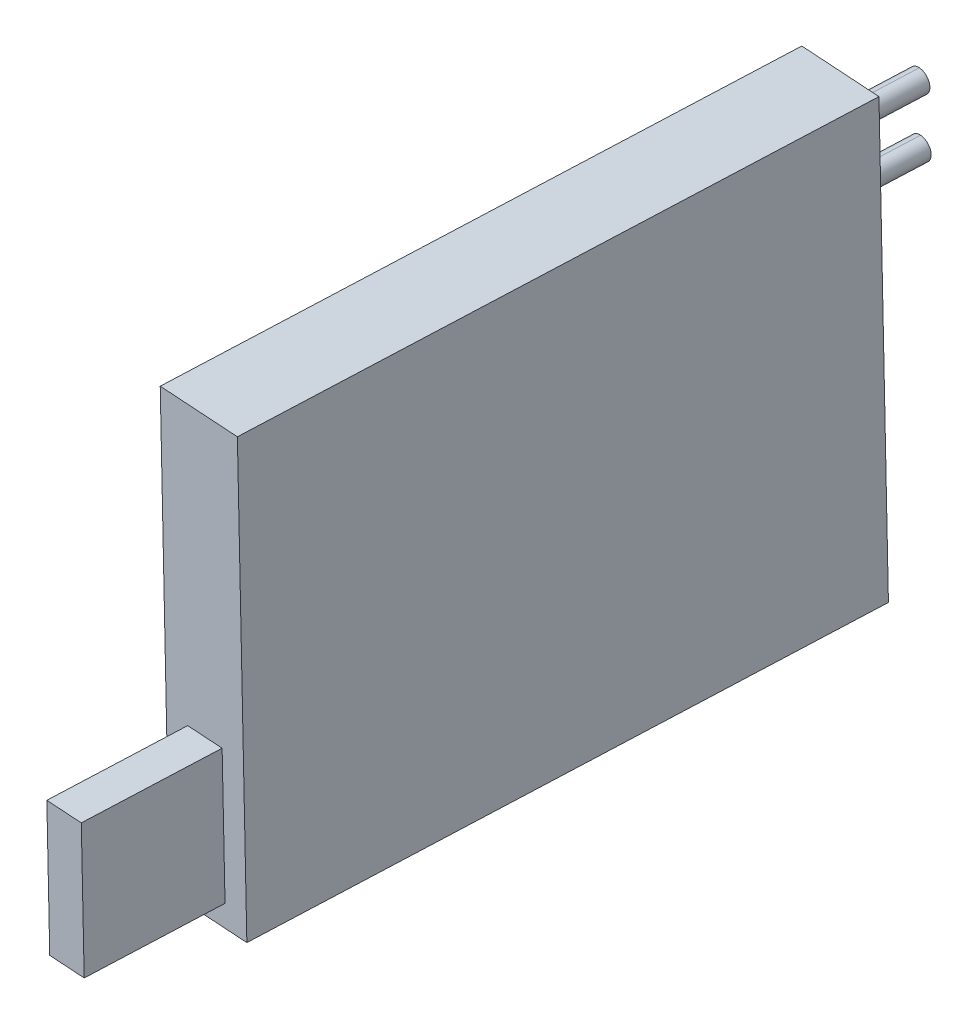
ISO-10303-21;
HEADER;
FILE_DESCRIPTION(('STEP AP214'),'2;1');
FILE_NAME('part.step','',(''),(''),'','','');
FILE_SCHEMA(('AUTOMOTIVE_DESIGN { 1 0 10303 214 1 1 1 1 }'));
ENDSEC;
DATA;
#1=APPLICATION_CONTEXT('core data for automotive mechanical design processes');
#2=APPLICATION_PROTOCOL_DEFINITION('international standard','automotive_design',2000,#1);
#3=PRODUCT_CONTEXT('',#1,'mechanical');
#4=PRODUCT('Part','Part','',(#3));
#5=PRODUCT_RELATED_PRODUCT_CATEGORY('part','',(#4));
#6=PRODUCT_DEFINITION_FORMATION('','',#4);
#7=PRODUCT_DEFINITION_CONTEXT('part definition',#1,'design');
#8=PRODUCT_DEFINITION('design','',#6,#7);
#9=PRODUCT_DEFINITION_SHAPE('','',#8);
#10=(LENGTH_UNIT() NAMED_UNIT(*) SI_UNIT(.MILLI.,.METRE.));
#11=(NAMED_UNIT(*) PLANE_ANGLE_UNIT() SI_UNIT($,.RADIAN.));
#12=(NAMED_UNIT(*) SI_UNIT($,.STERADIAN.) SOLID_ANGLE_UNIT());
#13=UNCERTAINTY_MEASURE_WITH_UNIT(LENGTH_MEASURE(1.E-05),#10,'distance_accuracy_value','');
#14=(GEOMETRIC_REPRESENTATION_CONTEXT(3) GLOBAL_UNCERTAINTY_ASSIGNED_CONTEXT((#13)) GLOBAL_UNIT_ASSIGNED_CONTEXT((#10,
#11,#12)) REPRESENTATION_CONTEXT('',''));
#15=CARTESIAN_POINT('',(0.,0.,0.));
#16=DIRECTION('',(0.,0.,1.));
#17=DIRECTION('',(1.,0.,0.));
#18=AXIS2_PLACEMENT_3D('',#15,#16,#17);
#19=CARTESIAN_POINT('',(-36.648079347406,344.820593225268,51.9658327744812));
#20=DIRECTION('',(0.997981596765968,-1.57E-13,0.063503799228458));
#21=DIRECTION('',(0.0634908764880217,0.0201729939782295,-0.997778511953799));
#22=AXIS2_PLACEMENT_3D('',#19,#20,#21);
#23=PLANE('',#22);
#24=DIRECTION('',(-0.0634908764880217,-0.0201729939782295,0.997778511953799));
#25=VECTOR('',#24,1.);
#26=CARTESIAN_POINT('',(-35.3657323057906,360.231087168598,31.8133574305576));
#27=LINE('',#26,#25);
#28=CARTESIAN_POINT('',(-35.3657323057906,360.231087168598,31.8133574305576));
#29=VERTEX_POINT('',#28);
#30=CARTESIAN_POINT('',(-37.9688582417995,359.403994415491,72.7222764206633));
#31=VERTEX_POINT('',#30);
#32=EDGE_CURVE('E183',#29,#31,#27,.T.);
#33=ORIENTED_EDGE('',*,*,#32,.F.);
#34=DIRECTION('',(-0.00128106175927373,0.999796504451758,0.0201322767419537));
#35=VECTOR('',#34,1.);
#36=CARTESIAN_POINT('',(-35.3273004530124,330.237192035045,31.209389128299));
#37=LINE('',#36,#35);
#38=CARTESIAN_POINT('',(-35.3273004530124,330.237192035045,31.209389128299));
#39=VERTEX_POINT('',#38);
#40=EDGE_CURVE('E41',#39,#29,#37,.T.);
#41=ORIENTED_EDGE('',*,*,#40,.F.);
#42=DIRECTION('',(0.0634908764880217,0.0201729939782295,-0.997778511953799));
#43=VECTOR('',#42,1.);
#44=CARTESIAN_POINT('',(-37.9304263890213,329.410099281938,72.1183081184047));
#45=LINE('',#44,#43);
#46=CARTESIAN_POINT('',(-37.9304263890213,329.410099281938,72.1183081184047));
#47=VERTEX_POINT('',#46);
#48=EDGE_CURVE('E199',#47,#39,#45,.T.);
#49=ORIENTED_EDGE('',*,*,#48,.F.);
#50=DIRECTION('',(0.00128106175927373,-0.999796504451758,-0.0201322767419537));
#51=VECTOR('',#50,1.);
#52=CARTESIAN_POINT('',(-37.9688582417995,359.403994415491,72.7222764206633));
#53=LINE('',#52,#51);
#54=EDGE_CURVE('E27',#31,#47,#53,.T.);
#55=ORIENTED_EDGE('',*,*,#54,.F.);
#56=EDGE_LOOP('',(#33,#41,#49,#55));
#57=FACE_BOUND('',#56,.T.);
#58=CARTESIAN_POINT('',(-35.5863882060016,334.155686076939,35.281032283082));
#59=DIRECTION('',(-0.997981596765968,1.57E-13,-0.063503799228458));
#60=DIRECTION('',(0.0634908764880217,0.0201729939782295,-0.997778511953799));
#61=AXIS2_PLACEMENT_3D('',#58,#59,#60);
#62=CIRCLE('',#61,0.6);
#63=CARTESIAN_POINT('',(-35.5482936801088,334.167789873326,34.6823651759097));
#64=VERTEX_POINT('',#63);
#65=CARTESIAN_POINT('',(-35.6244827318944,334.143582280552,35.8796993902543));
#66=VERTEX_POINT('',#65);
#67=EDGE_CURVE('E232',#64,#66,#62,.T.);
#68=ORIENTED_EDGE('',*,*,#67,.F.);
#69=CARTESIAN_POINT('',(-35.5863882060016,334.155686076939,35.281032283082));
#70=DIRECTION('',(-0.997981596765968,1.57E-13,-0.063503799228458));
#71=DIRECTION('',(-0.0634908764880217,-0.0201729939782295,0.997778511953799));
#72=AXIS2_PLACEMENT_3D('',#69,#70,#71);
#73=CIRCLE('',#72,0.6);
#74=EDGE_CURVE('E161',#66,#64,#73,.T.);
#75=ORIENTED_EDGE('',*,*,#74,.F.);
#76=EDGE_LOOP('',(#68,#75));
#77=FACE_BOUND('',#76,.T.);
#78=CARTESIAN_POINT('',(-36.0625697796618,334.004388622103,42.7643711227355));
#79=DIRECTION('',(-0.997981596765968,1.57E-13,-0.063503799228458));
#80=DIRECTION('',(0.0634908764880217,0.0201729939782295,-0.997778511953799));
#81=AXIS2_PLACEMENT_3D('',#78,#79,#80);
#82=CIRCLE('',#81,0.6);
#83=CARTESIAN_POINT('',(-36.024475253769,334.01649241849,42.1657040155632));
#84=VERTEX_POINT('',#83);
#85=CARTESIAN_POINT('',(-36.1006643055546,333.992284825716,43.3630382299078));
#86=VERTEX_POINT('',#85);
#87=EDGE_CURVE('E113',#84,#86,#82,.T.);
#88=ORIENTED_EDGE('',*,*,#87,.F.);
#89=CARTESIAN_POINT('',(-36.0625697796618,334.004388622103,42.7643711227355));
#90=DIRECTION('',(-0.997981596765968,1.57E-13,-0.063503799228458));
#91=DIRECTION('',(-0.0634908764880217,-0.0201729939782295,0.997778511953799));
#92=AXIS2_PLACEMENT_3D('',#89,#90,#91);
#93=CIRCLE('',#92,0.6);
#94=EDGE_CURVE('E115',#86,#84,#93,.T.);
#95=ORIENTED_EDGE('',*,*,#94,.F.);
#96=EDGE_LOOP('',(#88,#95));
#97=FACE_BOUND('',#96,.T.);
#98=ADVANCED_FACE('F16',(#57,#77,#97),#23,.F.);
#99=CARTESIAN_POINT('',(-37.9688582417995,359.403994415491,72.7222764206633));
#100=DIRECTION('',(-0.0634908764880217,-0.0201729939782295,0.997778511953799));
#101=DIRECTION('',(0.997981596765968,-1.57E-13,0.063503799228458));
#102=AXIS2_PLACEMENT_3D('',#99,#100,#101);
#103=PLANE('',#102);
#104=DIRECTION('',(0.997981596765968,-1.57E-13,0.063503799228458));
#105=VECTOR('',#104,1.);
#106=CARTESIAN_POINT('',(-37.9304263890213,329.410099281938,72.1183081184047));
#107=LINE('',#106,#105);
#108=CARTESIAN_POINT('',(-32.3417294471319,329.410099281937,72.4739293940841));
#109=VERTEX_POINT('',#108);
#110=EDGE_CURVE('E11',#47,#109,#107,.T.);
#111=ORIENTED_EDGE('',*,*,#110,.T.);
#112=DIRECTION('',(0.00128106175927373,-0.999796504451758,-0.0201322767419537));
#113=VECTOR('',#112,1.);
#114=CARTESIAN_POINT('',(-32.3801612999101,359.40399441549,73.0778976963427));
#115=LINE('',#114,#113);
#116=CARTESIAN_POINT('',(-32.3801612999101,359.40399441549,73.0778976963427));
#117=VERTEX_POINT('',#116);
#118=EDGE_CURVE('E206',#117,#109,#115,.T.);
#119=ORIENTED_EDGE('',*,*,#118,.F.);
#120=DIRECTION('',(0.997981596765968,-1.57E-13,0.063503799228458));
#121=VECTOR('',#120,1.);
#122=CARTESIAN_POINT('',(-37.9688582417995,359.403994415491,72.7222764206633));
#123=LINE('',#122,#121);
#124=EDGE_CURVE('E179',#31,#117,#123,.T.);
#125=ORIENTED_EDGE('',*,*,#124,.F.);
#126=ORIENTED_EDGE('',*,*,#54,.T.);
#127=EDGE_LOOP('',(#111,#119,#125,#126));
#128=FACE_BOUND('',#127,.T.);
#129=DIRECTION('',(-0.997981596765968,1.57E-13,-0.063503799228458));
#130=VECTOR('',#129,1.);
#131=CARTESIAN_POINT('',(-33.9023082829434,340.107921879571,72.5909138664189));
#132=LINE('',#131,#130);
#133=CARTESIAN_POINT('',(-33.9023082829434,340.107921879571,72.5909138664189));
#134=VERTEX_POINT('',#133);
#135=CARTESIAN_POINT('',(-36.3972622748583,340.107921879571,72.4321543683477));
#136=VERTEX_POINT('',#135);
#137=EDGE_CURVE('E220',#134,#136,#132,.T.);
#138=ORIENTED_EDGE('',*,*,#137,.F.);
#139=DIRECTION('',(-0.00128106175927373,0.999796504451758,0.0201322767419537));
#140=VECTOR('',#139,1.);
#141=CARTESIAN_POINT('',(-33.8905225147581,330.909794038615,72.4056969203929));
#142=LINE('',#141,#140);
#143=CARTESIAN_POINT('',(-33.8905225147581,330.909794038615,72.4056969203929));
#144=VERTEX_POINT('',#143);
#145=EDGE_CURVE('E189',#144,#134,#142,.T.);
#146=ORIENTED_EDGE('',*,*,#145,.F.);
#147=DIRECTION('',(0.997981596765968,-1.57E-13,0.063503799228458));
#148=VECTOR('',#147,1.);
#149=CARTESIAN_POINT('',(-36.385476506673,330.909794038615,72.2469374223218));
#150=LINE('',#149,#148);
#151=CARTESIAN_POINT('',(-36.385476506673,330.909794038615,72.2469374223218));
#152=VERTEX_POINT('',#151);
#153=EDGE_CURVE('E237',#152,#144,#150,.T.);
#154=ORIENTED_EDGE('',*,*,#153,.F.);
#155=DIRECTION('',(0.00128106175927373,-0.999796504451758,-0.0201322767419537));
#156=VECTOR('',#155,1.);
#157=CARTESIAN_POINT('',(-36.3972622748583,340.107921879571,72.4321543683477));
#158=LINE('',#157,#156);
#159=EDGE_CURVE('E211',#136,#152,#158,.T.);
#160=ORIENTED_EDGE('',*,*,#159,.F.);
#161=EDGE_LOOP('',(#138,#146,#154,#160));
#162=FACE_BOUND('',#161,.T.);
#163=ADVANCED_FACE('F364',(#128,#162),#103,.T.);
#164=CARTESIAN_POINT('',(-35.3657323057906,360.231087168598,31.8133574305576));
#165=DIRECTION('',(-0.00128106175927373,0.999796504451758,0.0201322767419537));
#166=DIRECTION('',(0.0634908764880217,0.0201729939782295,-0.997778511953799));
#167=AXIS2_PLACEMENT_3D('',#164,#165,#166);
#168=PLANE('',#167);
#169=ORIENTED_EDGE('',*,*,#124,.T.);
#170=DIRECTION('',(-0.0634908764880217,-0.0201729939782295,0.997778511953799));
#171=VECTOR('',#170,1.);
#172=CARTESIAN_POINT('',(-29.7770353639012,360.231087168597,32.1689787062369));
#173=LINE('',#172,#171);
#174=CARTESIAN_POINT('',(-29.7770353639012,360.231087168597,32.1689787062369));
#175=VERTEX_POINT('',#174);
#176=EDGE_CURVE('E209',#175,#117,#173,.T.);
#177=ORIENTED_EDGE('',*,*,#176,.F.);
#178=DIRECTION('',(0.997981596765968,-1.57E-13,0.063503799228458));
#179=VECTOR('',#178,1.);
#180=CARTESIAN_POINT('',(-35.3657323057906,360.231087168598,31.8133574305576));
#181=LINE('',#180,#179);
#182=EDGE_CURVE('E202',#29,#175,#181,.T.);
#183=ORIENTED_EDGE('',*,*,#182,.F.);
#184=ORIENTED_EDGE('',*,*,#32,.T.);
#185=EDGE_LOOP('',(#169,#177,#183,#184));
#186=FACE_BOUND('',#185,.T.);
#187=ADVANCED_FACE('F370',(#186),#168,.T.);
#188=CARTESIAN_POINT('',(-35.3273004530124,330.237192035045,31.209389128299));
#189=DIRECTION('',(0.0634908764880217,0.0201729939782295,-0.997778511953799));
#190=DIRECTION('',(-0.00128106175927373,0.999796504451758,0.0201322767419537));
#191=AXIS2_PLACEMENT_3D('',#188,#189,#190);
#192=PLANE('',#191);
#193=ORIENTED_EDGE('',*,*,#182,.T.);
#194=DIRECTION('',(-0.00128106175927373,0.999796504451758,0.0201322767419537));
#195=VECTOR('',#194,1.);
#196=CARTESIAN_POINT('',(-29.738603511123,330.237192035044,31.5650104039783));
#197=LINE('',#196,#195);
#198=CARTESIAN_POINT('',(-29.738603511123,330.237192035044,31.5650104039783));
#199=VERTEX_POINT('',#198);
#200=EDGE_CURVE('E146',#199,#175,#197,.T.);
#201=ORIENTED_EDGE('',*,*,#200,.F.);
#202=DIRECTION('',(0.997981596765968,-1.57E-13,0.063503799228458));
#203=VECTOR('',#202,1.);
#204=CARTESIAN_POINT('',(-35.3273004530124,330.237192035045,31.209389128299));
#205=LINE('',#204,#203);
#206=EDGE_CURVE('E195',#39,#199,#205,.T.);
#207=ORIENTED_EDGE('',*,*,#206,.F.);
#208=ORIENTED_EDGE('',*,*,#40,.T.);
#209=EDGE_LOOP('',(#193,#201,#207,#208));
#210=FACE_BOUND('',#209,.T.);
#211=CARTESIAN_POINT('',(-32.5675406495681,357.231697655242,31.9307712381714));
#212=DIRECTION('',(0.0634908764880217,0.0201729939782295,-0.997778511953799));
#213=DIRECTION('',(-0.00128106175927373,0.999796504451758,0.0201322767419537));
#214=AXIS2_PLACEMENT_3D('',#211,#212,#213);
#215=CIRCLE('',#214,0.75);
#216=CARTESIAN_POINT('',(-32.5685014458876,357.981545033581,31.9458704457279));
#217=VERTEX_POINT('',#216);
#218=CARTESIAN_POINT('',(-32.5665798532486,356.481850276904,31.9156720306149));
#219=VERTEX_POINT('',#218);
#220=EDGE_CURVE('E150',#217,#219,#215,.T.);
#221=ORIENTED_EDGE('',*,*,#220,.F.);
#222=CARTESIAN_POINT('',(-32.5675406495681,357.231697655242,31.9307712381714));
#223=DIRECTION('',(0.0634908764880217,0.0201729939782295,-0.997778511953799));
#224=DIRECTION('',(0.00128106175927373,-0.999796504451758,-0.0201322767419537));
#225=AXIS2_PLACEMENT_3D('',#222,#223,#224);
#226=CIRCLE('',#225,0.75);
#227=EDGE_CURVE('E233',#219,#217,#226,.T.);
#228=ORIENTED_EDGE('',*,*,#227,.F.);
#229=EDGE_LOOP('',(#221,#228));
#230=FACE_BOUND('',#229,.T.);
#231=CARTESIAN_POINT('',(-32.562416402531,353.232511637435,31.8502421312036));
#232=DIRECTION('',(0.0634908764880217,0.0201729939782295,-0.997778511953799));
#233=DIRECTION('',(-0.00128106175927373,0.999796504451758,0.0201322767419537));
#234=AXIS2_PLACEMENT_3D('',#231,#232,#233);
#235=CIRCLE('',#234,0.75);
#236=CARTESIAN_POINT('',(-32.5633771988505,353.982359015774,31.8653413387601));
#237=VERTEX_POINT('',#236);
#238=CARTESIAN_POINT('',(-32.5614556062116,352.482664259096,31.8351429236471));
#239=VERTEX_POINT('',#238);
#240=EDGE_CURVE('E249',#237,#239,#235,.T.);
#241=ORIENTED_EDGE('',*,*,#240,.F.);
#242=CARTESIAN_POINT('',(-32.562416402531,353.232511637435,31.8502421312036));
#243=DIRECTION('',(0.0634908764880217,0.0201729939782295,-0.997778511953799));
#244=DIRECTION('',(0.00128106175927373,-0.999796504451758,-0.0201322767419537));
#245=AXIS2_PLACEMENT_3D('',#242,#243,#244);
#246=CIRCLE('',#245,0.75);
#247=EDGE_CURVE('E173',#239,#237,#246,.T.);
#248=ORIENTED_EDGE('',*,*,#247,.F.);
#249=EDGE_LOOP('',(#241,#248));
#250=FACE_BOUND('',#249,.T.);
#251=ADVANCED_FACE('F297',(#210,#230,#250),#192,.T.);
#252=CARTESIAN_POINT('',(-37.9304263890213,329.410099281938,72.1183081184047));
#253=DIRECTION('',(0.00128106175927373,-0.999796504451758,-0.0201322767419537));
#254=DIRECTION('',(-0.997981596765968,1.57E-13,-0.063503799228458));
#255=AXIS2_PLACEMENT_3D('',#252,#253,#254);
#256=PLANE('',#255);
#257=ORIENTED_EDGE('',*,*,#206,.T.);
#258=DIRECTION('',(0.0634908764880217,0.0201729939782295,-0.997778511953799));
#259=VECTOR('',#258,1.);
#260=CARTESIAN_POINT('',(-32.3417294471319,329.410099281937,72.4739293940841));
#261=LINE('',#260,#259);
#262=EDGE_CURVE('E258',#109,#199,#261,.T.);
#263=ORIENTED_EDGE('',*,*,#262,.F.);
#264=ORIENTED_EDGE('',*,*,#110,.F.);
#265=ORIENTED_EDGE('',*,*,#48,.T.);
#266=EDGE_LOOP('',(#257,#263,#264,#265));
#267=FACE_BOUND('',#266,.T.);
#268=ADVANCED_FACE('F375',(#267),#256,.T.);
#269=CARTESIAN_POINT('',(-31.0593824055166,344.820593225267,52.3214540501605));
#270=DIRECTION('',(0.997981596765968,-1.57E-13,0.063503799228458));
#271=DIRECTION('',(0.0634908764880217,0.0201729939782295,-0.997778511953799));
#272=AXIS2_PLACEMENT_3D('',#269,#270,#271);
#273=PLANE('',#272);
#274=ORIENTED_EDGE('',*,*,#262,.T.);
#275=ORIENTED_EDGE('',*,*,#200,.T.);
#276=ORIENTED_EDGE('',*,*,#176,.T.);
#277=ORIENTED_EDGE('',*,*,#118,.T.);
#278=EDGE_LOOP('',(#274,#275,#276,#277));
#279=FACE_BOUND('',#278,.T.);
#280=ADVANCED_FACE('F414',(#279),#273,.T.);
#281=CARTESIAN_POINT('',(-32.5675406495681,357.231697655242,31.9307712381714));
#282=DIRECTION('',(0.0634908764880217,0.0201729939782295,-0.997778511953799));
#283=DIRECTION('',(0.00128106175927373,-0.999796504451758,-0.0201322767419537));
#284=AXIS2_PLACEMENT_3D('',#281,#282,#283);
#285=CYLINDRICAL_SURFACE('',#284,0.75);
#286=DIRECTION('',(0.0634908764880217,0.0201729939782295,-0.997778511953799));
#287=VECTOR('',#286,1.);
#288=CARTESIAN_POINT('',(-32.5685014458876,357.981545033581,31.9458704457279));
#289=LINE('',#288,#287);
#290=CARTESIAN_POINT('',(-32.2510470634474,358.082410003472,26.9569778859589));
#291=VERTEX_POINT('',#290);
#292=EDGE_CURVE('E210',#217,#291,#289,.T.);
#293=ORIENTED_EDGE('',*,*,#292,.T.);
#294=CARTESIAN_POINT('',(-32.250086267128,357.332562625133,26.9418786784024));
#295=DIRECTION('',(0.0634908764880217,0.0201729939782295,-0.997778511953799));
#296=DIRECTION('',(0.00128106175927373,-0.999796504451758,-0.0201322767419537));
#297=AXIS2_PLACEMENT_3D('',#294,#295,#296);
#298=CIRCLE('',#297,0.75);
#299=CARTESIAN_POINT('',(-32.2491254708085,356.582715246795,26.9267794708459));
#300=VERTEX_POINT('',#299);
#301=EDGE_CURVE('E151',#300,#291,#298,.T.);
#302=ORIENTED_EDGE('',*,*,#301,.F.);
#303=DIRECTION('',(0.0634908764880217,0.0201729939782295,-0.997778511953799));
#304=VECTOR('',#303,1.);
#305=CARTESIAN_POINT('',(-32.5665798532486,356.481850276904,31.9156720306149));
#306=LINE('',#305,#304);
#307=EDGE_CURVE('E156',#219,#300,#306,.T.);
#308=ORIENTED_EDGE('',*,*,#307,.F.);
#309=ORIENTED_EDGE('',*,*,#227,.T.);
#310=EDGE_LOOP('',(#293,#302,#308,#309));
#311=FACE_BOUND('',#310,.T.);
#312=ADVANCED_FACE('F342',(#311),#285,.T.);
#313=CARTESIAN_POINT('',(-32.5675406495681,357.231697655242,31.9307712381714));
#314=DIRECTION('',(0.0634908764880217,0.0201729939782295,-0.997778511953799));
#315=DIRECTION('',(0.00128106175927373,-0.999796504451758,-0.0201322767419537));
#316=AXIS2_PLACEMENT_3D('',#313,#314,#315);
#317=CYLINDRICAL_SURFACE('',#316,0.75);
#318=ORIENTED_EDGE('',*,*,#307,.T.);
#319=CARTESIAN_POINT('',(-32.250086267128,357.332562625133,26.9418786784024));
#320=DIRECTION('',(0.0634908764880217,0.0201729939782295,-0.997778511953799));
#321=DIRECTION('',(-0.00128106175927373,0.999796504451758,0.0201322767419537));
#322=AXIS2_PLACEMENT_3D('',#319,#320,#321);
#323=CIRCLE('',#322,0.75);
#324=EDGE_CURVE('E148',#291,#300,#323,.T.);
#325=ORIENTED_EDGE('',*,*,#324,.F.);
#326=ORIENTED_EDGE('',*,*,#292,.F.);
#327=ORIENTED_EDGE('',*,*,#220,.T.);
#328=EDGE_LOOP('',(#318,#325,#326,#327));
#329=FACE_BOUND('',#328,.T.);
#330=ADVANCED_FACE('F349',(#329),#317,.T.);
#331=CARTESIAN_POINT('',(-35.0290619969614,345.335004571713,26.5224807196593));
#332=DIRECTION('',(0.0634908764880217,0.0201729939782295,-0.997778511953799));
#333=DIRECTION('',(-0.00128106175927373,0.999796504451758,0.0201322767419537));
#334=AXIS2_PLACEMENT_3D('',#331,#332,#333);
#335=PLANE('',#334);
#336=ORIENTED_EDGE('',*,*,#324,.T.);
#337=ORIENTED_EDGE('',*,*,#301,.T.);
#338=EDGE_LOOP('',(#336,#337));
#339=FACE_BOUND('',#338,.T.);
#340=ADVANCED_FACE('F351',(#339),#335,.T.);
#341=CARTESIAN_POINT('',(-35.0290619969614,345.335004571713,26.5224807196593));
#342=DIRECTION('',(0.0634908764880217,0.0201729939782295,-0.997778511953799));
#343=DIRECTION('',(-0.00128106175927373,0.999796504451758,0.0201322767419537));
#344=AXIS2_PLACEMENT_3D('',#341,#342,#343);
#345=PLANE('',#344);
#346=CARTESIAN_POINT('',(-32.2449620200909,353.333376607326,26.8613495714346));
#347=DIRECTION('',(0.0634908764880217,0.0201729939782295,-0.997778511953799));
#348=DIRECTION('',(-0.00128106175927373,0.999796504451758,0.0201322767419537));
#349=AXIS2_PLACEMENT_3D('',#346,#347,#348);
#350=CIRCLE('',#349,0.75);
#351=CARTESIAN_POINT('',(-32.2459228164103,354.083223985665,26.8764487789911));
#352=VERTEX_POINT('',#351);
#353=CARTESIAN_POINT('',(-32.2440012237714,352.583529228988,26.8462503638781));
#354=VERTEX_POINT('',#353);
#355=EDGE_CURVE('E274',#352,#354,#350,.T.);
#356=ORIENTED_EDGE('',*,*,#355,.T.);
#357=CARTESIAN_POINT('',(-32.2449620200909,353.333376607326,26.8613495714346));
#358=DIRECTION('',(0.0634908764880217,0.0201729939782295,-0.997778511953799));
#359=DIRECTION('',(0.00128106175927373,-0.999796504451758,-0.0201322767419537));
#360=AXIS2_PLACEMENT_3D('',#357,#358,#359);
#361=CIRCLE('',#360,0.75);
#362=EDGE_CURVE('E172',#354,#352,#361,.T.);
#363=ORIENTED_EDGE('',*,*,#362,.T.);
#364=EDGE_LOOP('',(#356,#363));
#365=FACE_BOUND('',#364,.T.);
#366=ADVANCED_FACE('F304',(#365),#345,.T.);
#367=CARTESIAN_POINT('',(-32.562416402531,353.232511637435,31.8502421312036));
#368=DIRECTION('',(0.0634908764880217,0.0201729939782295,-0.997778511953799));
#369=DIRECTION('',(0.00128106175927373,-0.999796504451758,-0.0201322767419537));
#370=AXIS2_PLACEMENT_3D('',#367,#368,#369);
#371=CYLINDRICAL_SURFACE('',#370,0.75);
#372=DIRECTION('',(0.0634908764880217,0.0201729939782295,-0.997778511953799));
#373=VECTOR('',#372,1.);
#374=CARTESIAN_POINT('',(-32.5633771988505,353.982359015774,31.8653413387601));
#375=LINE('',#374,#373);
#376=EDGE_CURVE('E168',#237,#352,#375,.T.);
#377=ORIENTED_EDGE('',*,*,#376,.T.);
#378=ORIENTED_EDGE('',*,*,#362,.F.);
#379=DIRECTION('',(0.0634908764880217,0.0201729939782295,-0.997778511953799));
#380=VECTOR('',#379,1.);
#381=CARTESIAN_POINT('',(-32.5614556062116,352.482664259096,31.8351429236471));
#382=LINE('',#381,#380);
#383=EDGE_CURVE('E245',#239,#354,#382,.T.);
#384=ORIENTED_EDGE('',*,*,#383,.F.);
#385=ORIENTED_EDGE('',*,*,#247,.T.);
#386=EDGE_LOOP('',(#377,#378,#384,#385));
#387=FACE_BOUND('',#386,.T.);
#388=ADVANCED_FACE('F299',(#387),#371,.T.);
#389=CARTESIAN_POINT('',(-32.562416402531,353.232511637435,31.8502421312036));
#390=DIRECTION('',(0.0634908764880217,0.0201729939782295,-0.997778511953799));
#391=DIRECTION('',(0.00128106175927373,-0.999796504451758,-0.0201322767419537));
#392=AXIS2_PLACEMENT_3D('',#389,#390,#391);
#393=CYLINDRICAL_SURFACE('',#392,0.75);
#394=ORIENTED_EDGE('',*,*,#383,.T.);
#395=ORIENTED_EDGE('',*,*,#355,.F.);
#396=ORIENTED_EDGE('',*,*,#376,.F.);
#397=ORIENTED_EDGE('',*,*,#240,.T.);
#398=EDGE_LOOP('',(#394,#395,#396,#397));
#399=FACE_BOUND('',#398,.T.);
#400=ADVANCED_FACE('F291',(#399),#393,.T.);
#401=CARTESIAN_POINT('',(-36.3972622748583,340.107921879571,72.4321543683477));
#402=DIRECTION('',(-0.997981596765968,1.57E-13,-0.063503799228458));
#403=DIRECTION('',(0.00128106175927373,-0.999796504451758,-0.0201322767419537));
#404=AXIS2_PLACEMENT_3D('',#401,#402,#403);
#405=PLANE('',#404);
#406=DIRECTION('',(-0.0634908764880217,-0.0201729939782295,0.997778511953799));
#407=VECTOR('',#406,1.);
#408=CARTESIAN_POINT('',(-36.385476506673,330.909794038615,72.2469374223218));
#409=LINE('',#408,#407);
#410=CARTESIAN_POINT('',(-36.9568943950652,330.728237092811,81.226944029906));
#411=VERTEX_POINT('',#410);
#412=EDGE_CURVE('E215',#152,#411,#409,.T.);
#413=ORIENTED_EDGE('',*,*,#412,.T.);
#414=DIRECTION('',(0.00128106175927373,-0.999796504451758,-0.0201322767419537));
#415=VECTOR('',#414,1.);
#416=CARTESIAN_POINT('',(-36.9686801632505,339.926364933767,81.4121609759319));
#417=LINE('',#416,#415);
#418=CARTESIAN_POINT('',(-36.9686801632505,339.926364933767,81.4121609759319));
#419=VERTEX_POINT('',#418);
#420=EDGE_CURVE('E20',#419,#411,#417,.T.);
#421=ORIENTED_EDGE('',*,*,#420,.F.);
#422=DIRECTION('',(-0.0634908764880217,-0.0201729939782295,0.997778511953799));
#423=VECTOR('',#422,1.);
#424=CARTESIAN_POINT('',(-36.3972622748583,340.107921879571,72.4321543683477));
#425=LINE('',#424,#423);
#426=EDGE_CURVE('E216',#136,#419,#425,.T.);
#427=ORIENTED_EDGE('',*,*,#426,.F.);
#428=ORIENTED_EDGE('',*,*,#159,.T.);
#429=EDGE_LOOP('',(#413,#421,#427,#428));
#430=FACE_BOUND('',#429,.T.);
#431=ADVANCED_FACE('F389',(#430),#405,.T.);
#432=CARTESIAN_POINT('',(-33.9023082829434,340.107921879571,72.5909138664189));
#433=DIRECTION('',(-0.00128106175927373,0.999796504451758,0.0201322767419537));
#434=DIRECTION('',(0.0634908764880217,0.0201729939782295,-0.997778511953799));
#435=AXIS2_PLACEMENT_3D('',#432,#433,#434);
#436=PLANE('',#435);
#437=ORIENTED_EDGE('',*,*,#426,.T.);
#438=DIRECTION('',(-0.997981596765968,1.57E-13,-0.063503799228458));
#439=VECTOR('',#438,1.);
#440=CARTESIAN_POINT('',(-34.4737261713356,339.926364933767,81.5709204740031));
#441=LINE('',#440,#439);
#442=CARTESIAN_POINT('',(-34.4737261713356,339.926364933767,81.5709204740031));
#443=VERTEX_POINT('',#442);
#444=EDGE_CURVE('E174',#443,#419,#441,.T.);
#445=ORIENTED_EDGE('',*,*,#444,.F.);
#446=DIRECTION('',(-0.0634908764880217,-0.0201729939782295,0.997778511953799));
#447=VECTOR('',#446,1.);
#448=CARTESIAN_POINT('',(-33.9023082829434,340.107921879571,72.5909138664189));
#449=LINE('',#448,#447);
#450=EDGE_CURVE('E193',#134,#443,#449,.T.);
#451=ORIENTED_EDGE('',*,*,#450,.F.);
#452=ORIENTED_EDGE('',*,*,#137,.T.);
#453=EDGE_LOOP('',(#437,#445,#451,#452));
#454=FACE_BOUND('',#453,.T.);
#455=ADVANCED_FACE('F18',(#454),#436,.T.);
#456=CARTESIAN_POINT('',(-33.8905225147581,330.909794038615,72.4056969203929));
#457=DIRECTION('',(0.997981596765968,-1.57E-13,0.063503799228458));
#458=DIRECTION('',(0.0634908764880217,0.0201729939782295,-0.997778511953799));
#459=AXIS2_PLACEMENT_3D('',#456,#457,#458);
#460=PLANE('',#459);
#461=ORIENTED_EDGE('',*,*,#450,.T.);
#462=DIRECTION('',(-0.00128106175927373,0.999796504451758,0.0201322767419537));
#463=VECTOR('',#462,1.);
#464=CARTESIAN_POINT('',(-34.4619404031502,330.728237092811,81.3857035279771));
#465=LINE('',#464,#463);
#466=CARTESIAN_POINT('',(-34.4619404031502,330.728237092811,81.3857035279771));
#467=VERTEX_POINT('',#466);
#468=EDGE_CURVE('E177',#467,#443,#465,.T.);
#469=ORIENTED_EDGE('',*,*,#468,.F.);
#470=DIRECTION('',(-0.0634908764880217,-0.0201729939782295,0.997778511953799));
#471=VECTOR('',#470,1.);
#472=CARTESIAN_POINT('',(-33.8905225147581,330.909794038615,72.4056969203929));
#473=LINE('',#472,#471);
#474=EDGE_CURVE('E194',#144,#467,#473,.T.);
#475=ORIENTED_EDGE('',*,*,#474,.F.);
#476=ORIENTED_EDGE('',*,*,#145,.T.);
#477=EDGE_LOOP('',(#461,#469,#475,#476));
#478=FACE_BOUND('',#477,.T.);
#479=ADVANCED_FACE('F408',(#478),#460,.T.);
#480=CARTESIAN_POINT('',(-36.385476506673,330.909794038615,72.2469374223218));
#481=DIRECTION('',(0.00128106175927373,-0.999796504451758,-0.0201322767419537));
#482=DIRECTION('',(-0.997981596765968,1.57E-13,-0.063503799228458));
#483=AXIS2_PLACEMENT_3D('',#480,#481,#482);
#484=PLANE('',#483);
#485=ORIENTED_EDGE('',*,*,#474,.T.);
#486=DIRECTION('',(0.997981596765968,-1.57E-13,0.063503799228458));
#487=VECTOR('',#486,1.);
#488=CARTESIAN_POINT('',(-36.9568943950652,330.728237092811,81.226944029906));
#489=LINE('',#488,#487);
#490=EDGE_CURVE('E224',#411,#467,#489,.T.);
#491=ORIENTED_EDGE('',*,*,#490,.F.);
#492=ORIENTED_EDGE('',*,*,#412,.F.);
#493=ORIENTED_EDGE('',*,*,#153,.T.);
#494=EDGE_LOOP('',(#485,#491,#492,#493));
#495=FACE_BOUND('',#494,.T.);
#496=ADVANCED_FACE('F392',(#495),#484,.T.);
#497=CARTESIAN_POINT('',(-38.5210602038026,344.22548990291,81.4002988771182));
#498=DIRECTION('',(-0.0634908764880217,-0.0201729939782295,0.997778511953799));
#499=DIRECTION('',(0.997981596765968,-1.57E-13,0.063503799228458));
#500=AXIS2_PLACEMENT_3D('',#497,#498,#499);
#501=PLANE('',#500);
#502=ORIENTED_EDGE('',*,*,#490,.T.);
#503=ORIENTED_EDGE('',*,*,#468,.T.);
#504=ORIENTED_EDGE('',*,*,#444,.T.);
#505=ORIENTED_EDGE('',*,*,#420,.T.);
#506=EDGE_LOOP('',(#502,#503,#504,#505));
#507=FACE_BOUND('',#506,.T.);
#508=ADVANCED_FACE('F385',(#507),#501,.T.);
#509=CARTESIAN_POINT('',(-35.5863882060016,334.155686076939,35.281032283082));
#510=DIRECTION('',(-0.997981596765968,1.57E-13,-0.063503799228458));
#511=DIRECTION('',(-0.0634908764880217,-0.0201729939782295,0.997778511953799));
#512=AXIS2_PLACEMENT_3D('',#509,#510,#511);
#513=CYLINDRICAL_SURFACE('',#512,0.6);
#514=DIRECTION('',(-0.997981596765968,1.57E-13,-0.063503799228458));
#515=VECTOR('',#514,1.);
#516=CARTESIAN_POINT('',(-35.5482936801088,334.167789873326,34.6823651759097));
#517=LINE('',#516,#515);
#518=CARTESIAN_POINT('',(-36.5462752768748,334.167789873327,34.6188613766812));
#519=VERTEX_POINT('',#518);
#520=EDGE_CURVE('E157',#64,#519,#517,.T.);
#521=ORIENTED_EDGE('',*,*,#520,.T.);
#522=CARTESIAN_POINT('',(-36.5843698027676,334.15568607694,35.2175284838535));
#523=DIRECTION('',(-0.997981596765968,1.57E-13,-0.063503799228458));
#524=DIRECTION('',(-0.0634908764880217,-0.0201729939782295,0.997778511953799));
#525=AXIS2_PLACEMENT_3D('',#522,#523,#524);
#526=CIRCLE('',#525,0.6);
#527=CARTESIAN_POINT('',(-36.6224643286604,334.143582280553,35.8161955910258));
#528=VERTEX_POINT('',#527);
#529=EDGE_CURVE('E184',#528,#519,#526,.T.);
#530=ORIENTED_EDGE('',*,*,#529,.F.);
#531=DIRECTION('',(-0.997981596765968,1.57E-13,-0.063503799228458));
#532=VECTOR('',#531,1.);
#533=CARTESIAN_POINT('',(-35.6244827318944,334.143582280552,35.8796993902543));
#534=LINE('',#533,#532);
#535=EDGE_CURVE('E167',#66,#528,#534,.T.);
#536=ORIENTED_EDGE('',*,*,#535,.F.);
#537=ORIENTED_EDGE('',*,*,#74,.T.);
#538=EDGE_LOOP('',(#521,#530,#536,#537));
#539=FACE_BOUND('',#538,.T.);
#540=ADVANCED_FACE('F381',(#539),#513,.T.);
#541=CARTESIAN_POINT('',(-35.5863882060016,334.155686076939,35.281032283082));
#542=DIRECTION('',(-0.997981596765968,1.57E-13,-0.063503799228458));
#543=DIRECTION('',(-0.0634908764880217,-0.0201729939782295,0.997778511953799));
#544=AXIS2_PLACEMENT_3D('',#541,#542,#543);
#545=CYLINDRICAL_SURFACE('',#544,0.6);
#546=ORIENTED_EDGE('',*,*,#535,.T.);
#547=CARTESIAN_POINT('',(-36.5843698027676,334.15568607694,35.2175284838535));
#548=DIRECTION('',(-0.997981596765968,1.57E-13,-0.063503799228458));
#549=DIRECTION('',(0.0634908764880217,0.0201729939782295,-0.997778511953799));
#550=AXIS2_PLACEMENT_3D('',#547,#548,#549);
#551=CIRCLE('',#550,0.6);
#552=EDGE_CURVE('E188',#519,#528,#551,.T.);
#553=ORIENTED_EDGE('',*,*,#552,.F.);
#554=ORIENTED_EDGE('',*,*,#520,.F.);
#555=ORIENTED_EDGE('',*,*,#67,.T.);
#556=EDGE_LOOP('',(#546,#553,#554,#555));
#557=FACE_BOUND('',#556,.T.);
#558=ADVANCED_FACE('F384',(#557),#545,.T.);
#559=CARTESIAN_POINT('',(-37.6460609441719,344.820593225268,51.9023289752527));
#560=DIRECTION('',(-0.997981596765968,1.57E-13,-0.063503799228458));
#561=DIRECTION('',(0.00128106175927373,-0.999796504451758,-0.0201322767419537));
#562=AXIS2_PLACEMENT_3D('',#559,#560,#561);
#563=PLANE('',#562);
#564=ORIENTED_EDGE('',*,*,#552,.T.);
#565=ORIENTED_EDGE('',*,*,#529,.T.);
#566=EDGE_LOOP('',(#564,#565));
#567=FACE_BOUND('',#566,.T.);
#568=ADVANCED_FACE('F396',(#567),#563,.T.);
#569=CARTESIAN_POINT('',(-37.6460609441719,344.820593225268,51.9023289752527));
#570=DIRECTION('',(-0.997981596765968,1.57E-13,-0.063503799228458));
#571=DIRECTION('',(0.00128106175927373,-0.999796504451758,-0.0201322767419537));
#572=AXIS2_PLACEMENT_3D('',#569,#570,#571);
#573=PLANE('',#572);
#574=CARTESIAN_POINT('',(-37.0605513764277,334.004388622103,42.700867323507));
#575=DIRECTION('',(-0.997981596765968,1.57E-13,-0.063503799228458));
#576=DIRECTION('',(0.0634908764880217,0.0201729939782295,-0.997778511953799));
#577=AXIS2_PLACEMENT_3D('',#574,#575,#576);
#578=CIRCLE('',#577,0.6);
#579=CARTESIAN_POINT('',(-37.0224568505349,334.01649241849,42.1022002163347));
#580=VERTEX_POINT('',#579);
#581=CARTESIAN_POINT('',(-37.0986459023205,333.992284825716,43.2995344306793));
#582=VERTEX_POINT('',#581);
#583=EDGE_CURVE('E134',#580,#582,#578,.T.);
#584=ORIENTED_EDGE('',*,*,#583,.T.);
#585=CARTESIAN_POINT('',(-37.0605513764277,334.004388622103,42.700867323507));
#586=DIRECTION('',(-0.997981596765968,1.57E-13,-0.063503799228458));
#587=DIRECTION('',(-0.0634908764880217,-0.0201729939782295,0.997778511953799));
#588=AXIS2_PLACEMENT_3D('',#585,#586,#587);
#589=CIRCLE('',#588,0.6);
#590=EDGE_CURVE('E136',#582,#580,#589,.T.);
#591=ORIENTED_EDGE('',*,*,#590,.T.);
#592=EDGE_LOOP('',(#584,#591));
#593=FACE_BOUND('',#592,.T.);
#594=ADVANCED_FACE('F400',(#593),#573,.T.);
#595=CARTESIAN_POINT('',(-36.0625697796618,334.004388622103,42.7643711227355));
#596=DIRECTION('',(-0.997981596765968,1.57E-13,-0.063503799228458));
#597=DIRECTION('',(-0.0634908764880217,-0.0201729939782295,0.997778511953799));
#598=AXIS2_PLACEMENT_3D('',#595,#596,#597);
#599=CYLINDRICAL_SURFACE('',#598,0.6);
#600=DIRECTION('',(-0.997981596765968,1.57E-13,-0.063503799228458));
#601=VECTOR('',#600,1.);
#602=CARTESIAN_POINT('',(-36.024475253769,334.01649241849,42.1657040155632));
#603=LINE('',#602,#601);
#604=EDGE_CURVE('E128',#84,#580,#603,.T.);
#605=ORIENTED_EDGE('',*,*,#604,.T.);
#606=ORIENTED_EDGE('',*,*,#590,.F.);
#607=DIRECTION('',(-0.997981596765968,1.57E-13,-0.063503799228458));
#608=VECTOR('',#607,1.);
#609=CARTESIAN_POINT('',(-36.1006643055546,333.992284825716,43.3630382299078));
#610=LINE('',#609,#608);
#611=EDGE_CURVE('E121',#86,#582,#610,.T.);
#612=ORIENTED_EDGE('',*,*,#611,.F.);
#613=ORIENTED_EDGE('',*,*,#94,.T.);
#614=EDGE_LOOP('',(#605,#606,#612,#613));
#615=FACE_BOUND('',#614,.T.);
#616=ADVANCED_FACE('F125',(#615),#599,.T.);
#617=CARTESIAN_POINT('',(-36.0625697796618,334.004388622103,42.7643711227355));
#618=DIRECTION('',(-0.997981596765968,1.57E-13,-0.063503799228458));
#619=DIRECTION('',(-0.0634908764880217,-0.0201729939782295,0.997778511953799));
#620=AXIS2_PLACEMENT_3D('',#617,#618,#619);
#621=CYLINDRICAL_SURFACE('',#620,0.6);
#622=ORIENTED_EDGE('',*,*,#611,.T.);
#623=ORIENTED_EDGE('',*,*,#583,.F.);
#624=ORIENTED_EDGE('',*,*,#604,.F.);
#625=ORIENTED_EDGE('',*,*,#87,.T.);
#626=EDGE_LOOP('',(#622,#623,#624,#625));
#627=FACE_BOUND('',#626,.T.);
#628=ADVANCED_FACE('F132',(#627),#621,.T.);
#629=CLOSED_SHELL('',(#98,#163,#187,#251,#268,#280,#312,#330,#340,#366,#388,#400,#431,#455,#479,
#496,#508,#540,#558,#568,#594,#616,#628));
#630=MANIFOLD_SOLID_BREP('B1',#629);
#631=ADVANCED_BREP_SHAPE_REPRESENTATION('',(#18,#630),#14);
#632=SHAPE_DEFINITION_REPRESENTATION(#9,#631);
ENDSEC;
END-ISO-10303-21;
